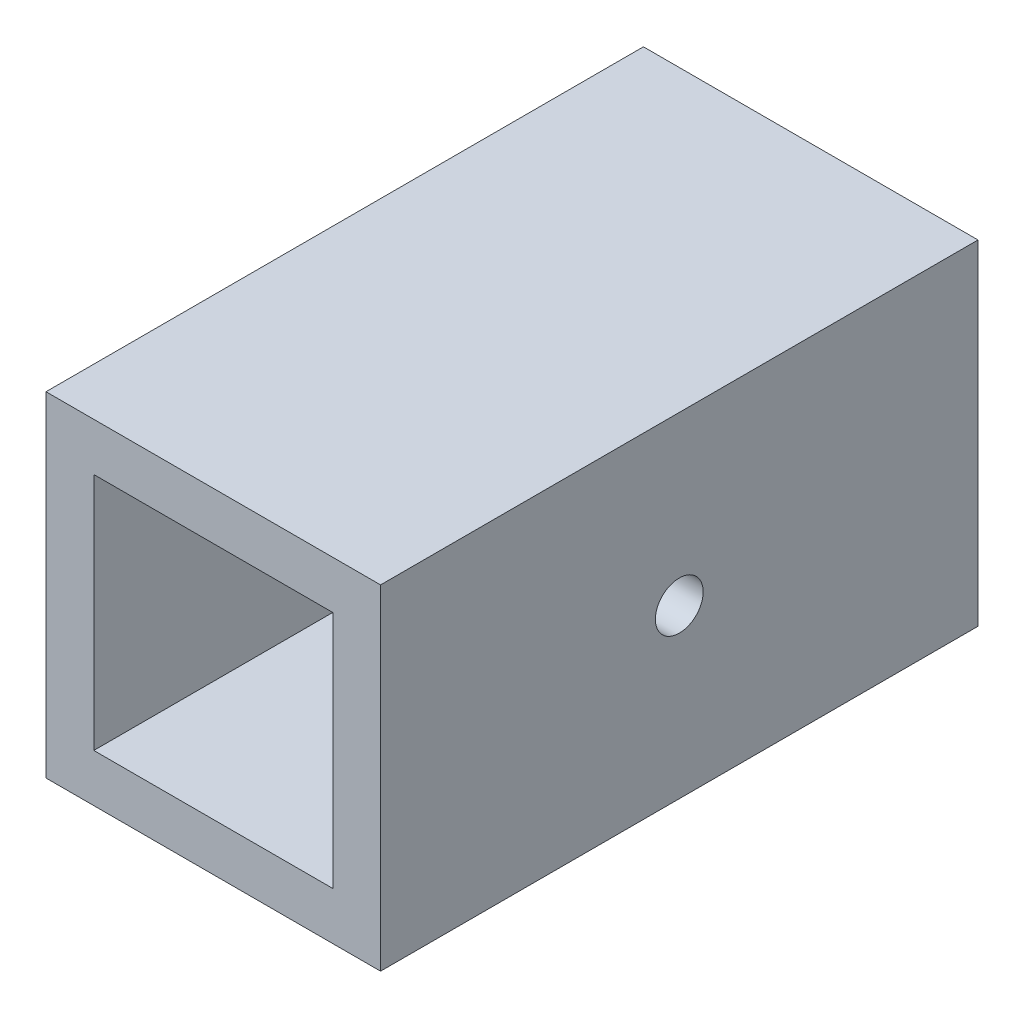
ISO-10303-21;
HEADER;
FILE_DESCRIPTION(('STEP AP214'),'2;1');
FILE_NAME('part.step','',(''),(''),'','','');
FILE_SCHEMA(('AUTOMOTIVE_DESIGN { 1 0 10303 214 1 1 1 1 }'));
ENDSEC;
DATA;
#1=APPLICATION_CONTEXT('core data for automotive mechanical design processes');
#2=APPLICATION_PROTOCOL_DEFINITION('international standard','automotive_design',2000,#1);
#3=PRODUCT_CONTEXT('',#1,'mechanical');
#4=PRODUCT('Part','Part','',(#3));
#5=PRODUCT_RELATED_PRODUCT_CATEGORY('part','',(#4));
#6=PRODUCT_DEFINITION_FORMATION('','',#4);
#7=PRODUCT_DEFINITION_CONTEXT('part definition',#1,'design');
#8=PRODUCT_DEFINITION('design','',#6,#7);
#9=PRODUCT_DEFINITION_SHAPE('','',#8);
#10=(LENGTH_UNIT() NAMED_UNIT(*) SI_UNIT(.MILLI.,.METRE.));
#11=(NAMED_UNIT(*) PLANE_ANGLE_UNIT() SI_UNIT($,.RADIAN.));
#12=(NAMED_UNIT(*) SI_UNIT($,.STERADIAN.) SOLID_ANGLE_UNIT());
#13=UNCERTAINTY_MEASURE_WITH_UNIT(LENGTH_MEASURE(1.E-05),#10,'distance_accuracy_value','');
#14=(GEOMETRIC_REPRESENTATION_CONTEXT(3) GLOBAL_UNCERTAINTY_ASSIGNED_CONTEXT((#13)) GLOBAL_UNIT_ASSIGNED_CONTEXT((#10,
#11,#12)) REPRESENTATION_CONTEXT('',''));
#15=CARTESIAN_POINT('',(0.,0.,0.));
#16=DIRECTION('',(0.,0.,1.));
#17=DIRECTION('',(1.,0.,0.));
#18=AXIS2_PLACEMENT_3D('',#15,#16,#17);
#19=CARTESIAN_POINT('',(0.,0.,0.));
#20=DIRECTION('',(0.,0.,-1.));
#21=DIRECTION('',(-1.,0.,0.));
#22=AXIS2_PLACEMENT_3D('',#19,#20,#21);
#23=PLANE('',#22);
#24=DIRECTION('',(0.,-1.,0.));
#25=VECTOR('',#24,1.);
#26=CARTESIAN_POINT('',(0.,0.,0.));
#27=LINE('',#26,#25);
#28=CARTESIAN_POINT('',(0.,14.,0.));
#29=VERTEX_POINT('',#28);
#30=CARTESIAN_POINT('',(0.,0.,0.));
#31=VERTEX_POINT('',#30);
#32=EDGE_CURVE('E205',#29,#31,#27,.T.);
#33=ORIENTED_EDGE('',*,*,#32,.F.);
#34=DIRECTION('',(-1.,0.,0.));
#35=VECTOR('',#34,1.);
#36=CARTESIAN_POINT('',(0.,14.,0.));
#37=LINE('',#36,#35);
#38=CARTESIAN_POINT('',(14.,14.,0.));
#39=VERTEX_POINT('',#38);
#40=EDGE_CURVE('E212',#39,#29,#37,.T.);
#41=ORIENTED_EDGE('',*,*,#40,.F.);
#42=DIRECTION('',(0.,1.,0.));
#43=VECTOR('',#42,1.);
#44=CARTESIAN_POINT('',(14.,0.,0.));
#45=LINE('',#44,#43);
#46=CARTESIAN_POINT('',(14.,0.,0.));
#47=VERTEX_POINT('',#46);
#48=EDGE_CURVE('E210',#47,#39,#45,.T.);
#49=ORIENTED_EDGE('',*,*,#48,.F.);
#50=DIRECTION('',(1.,0.,0.));
#51=VECTOR('',#50,1.);
#52=CARTESIAN_POINT('',(0.,0.,0.));
#53=LINE('',#52,#51);
#54=EDGE_CURVE('E208',#31,#47,#53,.T.);
#55=ORIENTED_EDGE('',*,*,#54,.F.);
#56=EDGE_LOOP('',(#33,#41,#49,#55));
#57=FACE_BOUND('',#56,.T.);
#58=DIRECTION('',(-1.,0.,0.));
#59=VECTOR('',#58,1.);
#60=CARTESIAN_POINT('',(2.,12.,0.));
#61=LINE('',#60,#59);
#62=CARTESIAN_POINT('',(12.,12.,0.));
#63=VERTEX_POINT('',#62);
#64=CARTESIAN_POINT('',(2.,12.,0.));
#65=VERTEX_POINT('',#64);
#66=EDGE_CURVE('E176',#63,#65,#61,.T.);
#67=ORIENTED_EDGE('',*,*,#66,.T.);
#68=DIRECTION('',(0.,-1.,0.));
#69=VECTOR('',#68,1.);
#70=CARTESIAN_POINT('',(2.,2.,0.));
#71=LINE('',#70,#69);
#72=CARTESIAN_POINT('',(2.,2.,0.));
#73=VERTEX_POINT('',#72);
#74=EDGE_CURVE('E171',#65,#73,#71,.T.);
#75=ORIENTED_EDGE('',*,*,#74,.T.);
#76=DIRECTION('',(1.,0.,0.));
#77=VECTOR('',#76,1.);
#78=CARTESIAN_POINT('',(2.,2.,0.));
#79=LINE('',#78,#77);
#80=CARTESIAN_POINT('',(12.,2.,0.));
#81=VERTEX_POINT('',#80);
#82=EDGE_CURVE('E188',#73,#81,#79,.T.);
#83=ORIENTED_EDGE('',*,*,#82,.T.);
#84=DIRECTION('',(0.,1.,0.));
#85=VECTOR('',#84,1.);
#86=CARTESIAN_POINT('',(12.,2.,0.));
#87=LINE('',#86,#85);
#88=EDGE_CURVE('E191',#81,#63,#87,.T.);
#89=ORIENTED_EDGE('',*,*,#88,.T.);
#90=EDGE_LOOP('',(#67,#75,#83,#89));
#91=FACE_BOUND('',#90,.T.);
#92=ADVANCED_FACE('F33',(#57,#91),#23,.T.);
#93=CARTESIAN_POINT('',(0.,0.,10.));
#94=DIRECTION('',(1.,0.,0.));
#95=DIRECTION('',(0.,0.,-1.));
#96=AXIS2_PLACEMENT_3D('',#93,#94,#95);
#97=PLANE('',#96);
#98=CARTESIAN_POINT('',(0.,7.,12.5));
#99=DIRECTION('',(1.,0.,0.));
#100=DIRECTION('',(0.,0.,-1.));
#101=AXIS2_PLACEMENT_3D('',#98,#99,#100);
#102=CIRCLE('',#101,1.);
#103=CARTESIAN_POINT('',(0.,7.,11.5));
#104=VERTEX_POINT('',#103);
#105=EDGE_CURVE('E150',#104,#104,#102,.T.);
#106=ORIENTED_EDGE('',*,*,#105,.T.);
#107=EDGE_LOOP('',(#106));
#108=FACE_BOUND('',#107,.T.);
#109=ORIENTED_EDGE('',*,*,#32,.T.);
#110=DIRECTION('',(0.,0.,-1.));
#111=VECTOR('',#110,1.);
#112=CARTESIAN_POINT('',(0.,0.,10.));
#113=LINE('',#112,#111);
#114=CARTESIAN_POINT('',(0.,0.,25.));
#115=VERTEX_POINT('',#114);
#116=EDGE_CURVE('E11',#115,#31,#113,.T.);
#117=ORIENTED_EDGE('',*,*,#116,.F.);
#118=DIRECTION('',(0.,-1.,0.));
#119=VECTOR('',#118,1.);
#120=CARTESIAN_POINT('',(0.,14.,25.));
#121=LINE('',#120,#119);
#122=CARTESIAN_POINT('',(0.,14.,25.));
#123=VERTEX_POINT('',#122);
#124=EDGE_CURVE('E136',#123,#115,#121,.T.);
#125=ORIENTED_EDGE('',*,*,#124,.F.);
#126=DIRECTION('',(0.,0.,-1.));
#127=VECTOR('',#126,1.);
#128=CARTESIAN_POINT('',(0.,14.,10.));
#129=LINE('',#128,#127);
#130=EDGE_CURVE('E214',#123,#29,#129,.T.);
#131=ORIENTED_EDGE('',*,*,#130,.T.);
#132=EDGE_LOOP('',(#109,#117,#125,#131));
#133=FACE_BOUND('',#132,.T.);
#134=ADVANCED_FACE('F35',(#108,#133),#97,.F.);
#135=CARTESIAN_POINT('',(0.,0.,10.));
#136=DIRECTION('',(0.,1.,0.));
#137=DIRECTION('',(0.,0.,1.));
#138=AXIS2_PLACEMENT_3D('',#135,#136,#137);
#139=PLANE('',#138);
#140=ORIENTED_EDGE('',*,*,#54,.T.);
#141=DIRECTION('',(0.,0.,-1.));
#142=VECTOR('',#141,1.);
#143=CARTESIAN_POINT('',(14.,0.,10.));
#144=LINE('',#143,#142);
#145=CARTESIAN_POINT('',(14.,0.,25.));
#146=VERTEX_POINT('',#145);
#147=EDGE_CURVE('E41',#146,#47,#144,.T.);
#148=ORIENTED_EDGE('',*,*,#147,.F.);
#149=DIRECTION('',(1.,0.,0.));
#150=VECTOR('',#149,1.);
#151=CARTESIAN_POINT('',(0.,0.,25.));
#152=LINE('',#151,#150);
#153=EDGE_CURVE('E162',#115,#146,#152,.T.);
#154=ORIENTED_EDGE('',*,*,#153,.F.);
#155=ORIENTED_EDGE('',*,*,#116,.T.);
#156=EDGE_LOOP('',(#140,#148,#154,#155));
#157=FACE_BOUND('',#156,.T.);
#158=ADVANCED_FACE('F236',(#157),#139,.F.);
#159=CARTESIAN_POINT('',(14.,0.,10.));
#160=DIRECTION('',(-1.,0.,0.));
#161=DIRECTION('',(0.,0.,1.));
#162=AXIS2_PLACEMENT_3D('',#159,#160,#161);
#163=PLANE('',#162);
#164=CARTESIAN_POINT('',(14.,7.,12.5));
#165=DIRECTION('',(1.,0.,0.));
#166=DIRECTION('',(0.,0.,-1.));
#167=AXIS2_PLACEMENT_3D('',#164,#165,#166);
#168=CIRCLE('',#167,1.);
#169=CARTESIAN_POINT('',(14.,7.,11.5));
#170=VERTEX_POINT('',#169);
#171=EDGE_CURVE('E389',#170,#170,#168,.T.);
#172=ORIENTED_EDGE('',*,*,#171,.F.);
#173=EDGE_LOOP('',(#172));
#174=FACE_BOUND('',#173,.T.);
#175=ORIENTED_EDGE('',*,*,#48,.T.);
#176=DIRECTION('',(0.,0.,-1.));
#177=VECTOR('',#176,1.);
#178=CARTESIAN_POINT('',(14.,14.,10.));
#179=LINE('',#178,#177);
#180=CARTESIAN_POINT('',(14.,14.,25.));
#181=VERTEX_POINT('',#180);
#182=EDGE_CURVE('E217',#181,#39,#179,.T.);
#183=ORIENTED_EDGE('',*,*,#182,.F.);
#184=DIRECTION('',(0.,1.,0.));
#185=VECTOR('',#184,1.);
#186=CARTESIAN_POINT('',(14.,14.,25.));
#187=LINE('',#186,#185);
#188=EDGE_CURVE('E165',#146,#181,#187,.T.);
#189=ORIENTED_EDGE('',*,*,#188,.F.);
#190=ORIENTED_EDGE('',*,*,#147,.T.);
#191=EDGE_LOOP('',(#175,#183,#189,#190));
#192=FACE_BOUND('',#191,.T.);
#193=ADVANCED_FACE('F223',(#174,#192),#163,.F.);
#194=CARTESIAN_POINT('',(0.,14.,10.));
#195=DIRECTION('',(0.,-1.,0.));
#196=DIRECTION('',(0.,0.,-1.));
#197=AXIS2_PLACEMENT_3D('',#194,#195,#196);
#198=PLANE('',#197);
#199=ORIENTED_EDGE('',*,*,#40,.T.);
#200=ORIENTED_EDGE('',*,*,#130,.F.);
#201=DIRECTION('',(-1.,0.,0.));
#202=VECTOR('',#201,1.);
#203=CARTESIAN_POINT('',(0.,14.,25.));
#204=LINE('',#203,#202);
#205=EDGE_CURVE('E168',#181,#123,#204,.T.);
#206=ORIENTED_EDGE('',*,*,#205,.F.);
#207=ORIENTED_EDGE('',*,*,#182,.T.);
#208=EDGE_LOOP('',(#199,#200,#206,#207));
#209=FACE_BOUND('',#208,.T.);
#210=ADVANCED_FACE('F231',(#209),#198,.F.);
#211=CARTESIAN_POINT('',(2.,2.,10.));
#212=DIRECTION('',(1.,0.,0.));
#213=DIRECTION('',(0.,0.,-1.));
#214=AXIS2_PLACEMENT_3D('',#211,#212,#213);
#215=PLANE('',#214);
#216=ORIENTED_EDGE('',*,*,#74,.F.);
#217=DIRECTION('',(0.,0.,-1.));
#218=VECTOR('',#217,1.);
#219=CARTESIAN_POINT('',(2.,12.,10.));
#220=LINE('',#219,#218);
#221=CARTESIAN_POINT('',(2.,12.,10.));
#222=VERTEX_POINT('',#221);
#223=EDGE_CURVE('E185',#222,#65,#220,.T.);
#224=ORIENTED_EDGE('',*,*,#223,.F.);
#225=DIRECTION('',(0.,-1.,0.));
#226=VECTOR('',#225,1.);
#227=CARTESIAN_POINT('',(2.,2.,10.));
#228=LINE('',#227,#226);
#229=CARTESIAN_POINT('',(2.,2.,10.));
#230=VERTEX_POINT('',#229);
#231=EDGE_CURVE('E172',#222,#230,#228,.T.);
#232=ORIENTED_EDGE('',*,*,#231,.T.);
#233=DIRECTION('',(0.,0.,-1.));
#234=VECTOR('',#233,1.);
#235=CARTESIAN_POINT('',(2.,2.,10.));
#236=LINE('',#235,#234);
#237=EDGE_CURVE('E202',#230,#73,#236,.T.);
#238=ORIENTED_EDGE('',*,*,#237,.T.);
#239=EDGE_LOOP('',(#216,#224,#232,#238));
#240=FACE_BOUND('',#239,.T.);
#241=ADVANCED_FACE('F251',(#240),#215,.T.);
#242=CARTESIAN_POINT('',(2.,2.,10.));
#243=DIRECTION('',(0.,1.,0.));
#244=DIRECTION('',(0.,0.,1.));
#245=AXIS2_PLACEMENT_3D('',#242,#243,#244);
#246=PLANE('',#245);
#247=ORIENTED_EDGE('',*,*,#82,.F.);
#248=ORIENTED_EDGE('',*,*,#237,.F.);
#249=DIRECTION('',(1.,0.,0.));
#250=VECTOR('',#249,1.);
#251=CARTESIAN_POINT('',(2.,2.,10.));
#252=LINE('',#251,#250);
#253=CARTESIAN_POINT('',(12.,2.,10.));
#254=VERTEX_POINT('',#253);
#255=EDGE_CURVE('E175',#230,#254,#252,.T.);
#256=ORIENTED_EDGE('',*,*,#255,.T.);
#257=DIRECTION('',(0.,0.,-1.));
#258=VECTOR('',#257,1.);
#259=CARTESIAN_POINT('',(12.,2.,10.));
#260=LINE('',#259,#258);
#261=EDGE_CURVE('E200',#254,#81,#260,.T.);
#262=ORIENTED_EDGE('',*,*,#261,.T.);
#263=EDGE_LOOP('',(#247,#248,#256,#262));
#264=FACE_BOUND('',#263,.T.);
#265=ADVANCED_FACE('F257',(#264),#246,.T.);
#266=CARTESIAN_POINT('',(12.,2.,10.));
#267=DIRECTION('',(-1.,0.,0.));
#268=DIRECTION('',(0.,0.,1.));
#269=AXIS2_PLACEMENT_3D('',#266,#267,#268);
#270=PLANE('',#269);
#271=ORIENTED_EDGE('',*,*,#88,.F.);
#272=ORIENTED_EDGE('',*,*,#261,.F.);
#273=DIRECTION('',(0.,1.,0.));
#274=VECTOR('',#273,1.);
#275=CARTESIAN_POINT('',(12.,2.,10.));
#276=LINE('',#275,#274);
#277=CARTESIAN_POINT('',(12.,12.,10.));
#278=VERTEX_POINT('',#277);
#279=EDGE_CURVE('E179',#254,#278,#276,.T.);
#280=ORIENTED_EDGE('',*,*,#279,.T.);
#281=DIRECTION('',(0.,0.,-1.));
#282=VECTOR('',#281,1.);
#283=CARTESIAN_POINT('',(12.,12.,10.));
#284=LINE('',#283,#282);
#285=EDGE_CURVE('E198',#278,#63,#284,.T.);
#286=ORIENTED_EDGE('',*,*,#285,.T.);
#287=EDGE_LOOP('',(#271,#272,#280,#286));
#288=FACE_BOUND('',#287,.T.);
#289=ADVANCED_FACE('F262',(#288),#270,.T.);
#290=CARTESIAN_POINT('',(2.,12.,10.));
#291=DIRECTION('',(0.,-1.,0.));
#292=DIRECTION('',(0.,0.,-1.));
#293=AXIS2_PLACEMENT_3D('',#290,#291,#292);
#294=PLANE('',#293);
#295=ORIENTED_EDGE('',*,*,#66,.F.);
#296=ORIENTED_EDGE('',*,*,#285,.F.);
#297=DIRECTION('',(-1.,0.,0.));
#298=VECTOR('',#297,1.);
#299=CARTESIAN_POINT('',(2.,12.,10.));
#300=LINE('',#299,#298);
#301=EDGE_CURVE('E182',#278,#222,#300,.T.);
#302=ORIENTED_EDGE('',*,*,#301,.T.);
#303=ORIENTED_EDGE('',*,*,#223,.T.);
#304=EDGE_LOOP('',(#295,#296,#302,#303));
#305=FACE_BOUND('',#304,.T.);
#306=ADVANCED_FACE('F268',(#305),#294,.T.);
#307=CARTESIAN_POINT('',(0.,0.,10.));
#308=DIRECTION('',(0.,0.,1.));
#309=DIRECTION('',(1.,0.,0.));
#310=AXIS2_PLACEMENT_3D('',#307,#308,#309);
#311=PLANE('',#310);
#312=ORIENTED_EDGE('',*,*,#231,.F.);
#313=ORIENTED_EDGE('',*,*,#301,.F.);
#314=ORIENTED_EDGE('',*,*,#279,.F.);
#315=ORIENTED_EDGE('',*,*,#255,.F.);
#316=EDGE_LOOP('',(#312,#313,#314,#315));
#317=FACE_BOUND('',#316,.T.);
#318=ADVANCED_FACE('F274',(#317),#311,.F.);
#319=CARTESIAN_POINT('',(0.,0.,25.));
#320=DIRECTION('',(0.,0.,1.));
#321=DIRECTION('',(1.,0.,0.));
#322=AXIS2_PLACEMENT_3D('',#319,#320,#321);
#323=PLANE('',#322);
#324=ORIENTED_EDGE('',*,*,#124,.T.);
#325=ORIENTED_EDGE('',*,*,#153,.T.);
#326=ORIENTED_EDGE('',*,*,#188,.T.);
#327=ORIENTED_EDGE('',*,*,#205,.T.);
#328=EDGE_LOOP('',(#324,#325,#326,#327));
#329=FACE_BOUND('',#328,.T.);
#330=DIRECTION('',(1.,0.,0.));
#331=VECTOR('',#330,1.);
#332=CARTESIAN_POINT('',(2.,2.,25.));
#333=LINE('',#332,#331);
#334=CARTESIAN_POINT('',(2.,2.,25.));
#335=VERTEX_POINT('',#334);
#336=CARTESIAN_POINT('',(12.,2.,25.));
#337=VERTEX_POINT('',#336);
#338=EDGE_CURVE('E130',#335,#337,#333,.T.);
#339=ORIENTED_EDGE('',*,*,#338,.F.);
#340=DIRECTION('',(0.,-1.,0.));
#341=VECTOR('',#340,1.);
#342=CARTESIAN_POINT('',(2.,12.,25.));
#343=LINE('',#342,#341);
#344=CARTESIAN_POINT('',(2.,12.,25.));
#345=VERTEX_POINT('',#344);
#346=EDGE_CURVE('E121',#345,#335,#343,.T.);
#347=ORIENTED_EDGE('',*,*,#346,.F.);
#348=DIRECTION('',(-1.,0.,0.));
#349=VECTOR('',#348,1.);
#350=CARTESIAN_POINT('',(2.,12.,25.));
#351=LINE('',#350,#349);
#352=CARTESIAN_POINT('',(12.,12.,25.));
#353=VERTEX_POINT('',#352);
#354=EDGE_CURVE('E144',#353,#345,#351,.T.);
#355=ORIENTED_EDGE('',*,*,#354,.F.);
#356=DIRECTION('',(0.,1.,0.));
#357=VECTOR('',#356,1.);
#358=CARTESIAN_POINT('',(12.,12.,25.));
#359=LINE('',#358,#357);
#360=EDGE_CURVE('E142',#337,#353,#359,.T.);
#361=ORIENTED_EDGE('',*,*,#360,.F.);
#362=EDGE_LOOP('',(#339,#347,#355,#361));
#363=FACE_BOUND('',#362,.T.);
#364=ADVANCED_FACE('F140',(#329,#363),#323,.T.);
#365=CARTESIAN_POINT('',(2.,12.,25.));
#366=DIRECTION('',(1.,0.,0.));
#367=DIRECTION('',(0.,1.,0.));
#368=AXIS2_PLACEMENT_3D('',#365,#366,#367);
#369=PLANE('',#368);
#370=DIRECTION('',(0.,-1.,0.));
#371=VECTOR('',#370,1.);
#372=CARTESIAN_POINT('',(2.,12.,15.));
#373=LINE('',#372,#371);
#374=CARTESIAN_POINT('',(2.,12.,15.));
#375=VERTEX_POINT('',#374);
#376=CARTESIAN_POINT('',(2.,2.,15.));
#377=VERTEX_POINT('',#376);
#378=EDGE_CURVE('E48',#375,#377,#373,.T.);
#379=ORIENTED_EDGE('',*,*,#378,.F.);
#380=DIRECTION('',(0.,0.,-1.));
#381=VECTOR('',#380,1.);
#382=CARTESIAN_POINT('',(2.,12.,25.));
#383=LINE('',#382,#381);
#384=EDGE_CURVE('E126',#345,#375,#383,.T.);
#385=ORIENTED_EDGE('',*,*,#384,.F.);
#386=ORIENTED_EDGE('',*,*,#346,.T.);
#387=DIRECTION('',(0.,0.,-1.));
#388=VECTOR('',#387,1.);
#389=CARTESIAN_POINT('',(2.,2.,25.));
#390=LINE('',#389,#388);
#391=EDGE_CURVE('E124',#335,#377,#390,.T.);
#392=ORIENTED_EDGE('',*,*,#391,.T.);
#393=EDGE_LOOP('',(#379,#385,#386,#392));
#394=FACE_BOUND('',#393,.T.);
#395=ADVANCED_FACE('F123',(#394),#369,.T.);
#396=CARTESIAN_POINT('',(2.,2.,25.));
#397=DIRECTION('',(0.,1.,0.));
#398=DIRECTION('',(0.,0.,1.));
#399=AXIS2_PLACEMENT_3D('',#396,#397,#398);
#400=PLANE('',#399);
#401=DIRECTION('',(1.,0.,0.));
#402=VECTOR('',#401,1.);
#403=CARTESIAN_POINT('',(2.,2.,15.));
#404=LINE('',#403,#402);
#405=CARTESIAN_POINT('',(12.,2.,15.));
#406=VERTEX_POINT('',#405);
#407=EDGE_CURVE('E52',#377,#406,#404,.T.);
#408=ORIENTED_EDGE('',*,*,#407,.F.);
#409=ORIENTED_EDGE('',*,*,#391,.F.);
#410=ORIENTED_EDGE('',*,*,#338,.T.);
#411=DIRECTION('',(0.,0.,-1.));
#412=VECTOR('',#411,1.);
#413=CARTESIAN_POINT('',(12.,2.,25.));
#414=LINE('',#413,#412);
#415=EDGE_CURVE('E137',#337,#406,#414,.T.);
#416=ORIENTED_EDGE('',*,*,#415,.T.);
#417=EDGE_LOOP('',(#408,#409,#410,#416));
#418=FACE_BOUND('',#417,.T.);
#419=ADVANCED_FACE('F134',(#418),#400,.T.);
#420=CARTESIAN_POINT('',(12.,12.,25.));
#421=DIRECTION('',(-1.,0.,0.));
#422=DIRECTION('',(0.,-1.,0.));
#423=AXIS2_PLACEMENT_3D('',#420,#421,#422);
#424=PLANE('',#423);
#425=DIRECTION('',(0.,1.,0.));
#426=VECTOR('',#425,1.);
#427=CARTESIAN_POINT('',(12.,12.,15.));
#428=LINE('',#427,#426);
#429=CARTESIAN_POINT('',(12.,12.,15.));
#430=VERTEX_POINT('',#429);
#431=EDGE_CURVE('E152',#406,#430,#428,.T.);
#432=ORIENTED_EDGE('',*,*,#431,.F.);
#433=ORIENTED_EDGE('',*,*,#415,.F.);
#434=ORIENTED_EDGE('',*,*,#360,.T.);
#435=DIRECTION('',(0.,0.,-1.));
#436=VECTOR('',#435,1.);
#437=CARTESIAN_POINT('',(12.,12.,25.));
#438=LINE('',#437,#436);
#439=EDGE_CURVE('E156',#353,#430,#438,.T.);
#440=ORIENTED_EDGE('',*,*,#439,.T.);
#441=EDGE_LOOP('',(#432,#433,#434,#440));
#442=FACE_BOUND('',#441,.T.);
#443=ADVANCED_FACE('F336',(#442),#424,.T.);
#444=CARTESIAN_POINT('',(2.,12.,25.));
#445=DIRECTION('',(0.,-1.,0.));
#446=DIRECTION('',(0.,0.,-1.));
#447=AXIS2_PLACEMENT_3D('',#444,#445,#446);
#448=PLANE('',#447);
#449=DIRECTION('',(-1.,0.,0.));
#450=VECTOR('',#449,1.);
#451=CARTESIAN_POINT('',(2.,12.,15.));
#452=LINE('',#451,#450);
#453=EDGE_CURVE('E131',#430,#375,#452,.T.);
#454=ORIENTED_EDGE('',*,*,#453,.F.);
#455=ORIENTED_EDGE('',*,*,#439,.F.);
#456=ORIENTED_EDGE('',*,*,#354,.T.);
#457=ORIENTED_EDGE('',*,*,#384,.T.);
#458=EDGE_LOOP('',(#454,#455,#456,#457));
#459=FACE_BOUND('',#458,.T.);
#460=ADVANCED_FACE('F345',(#459),#448,.T.);
#461=CARTESIAN_POINT('',(0.,0.,15.));
#462=DIRECTION('',(0.,0.,1.));
#463=DIRECTION('',(1.,0.,0.));
#464=AXIS2_PLACEMENT_3D('',#461,#462,#463);
#465=PLANE('',#464);
#466=ORIENTED_EDGE('',*,*,#378,.T.);
#467=ORIENTED_EDGE('',*,*,#407,.T.);
#468=ORIENTED_EDGE('',*,*,#431,.T.);
#469=ORIENTED_EDGE('',*,*,#453,.T.);
#470=EDGE_LOOP('',(#466,#467,#468,#469));
#471=FACE_BOUND('',#470,.T.);
#472=ADVANCED_FACE('F284',(#471),#465,.T.);
#473=CARTESIAN_POINT('',(-2.,7.,12.5));
#474=DIRECTION('',(1.,0.,0.));
#475=DIRECTION('',(0.,0.,-1.));
#476=AXIS2_PLACEMENT_3D('',#473,#474,#475);
#477=CYLINDRICAL_SURFACE('',#476,1.);
#478=ORIENTED_EDGE('',*,*,#171,.T.);
#479=EDGE_LOOP('',(#478));
#480=FACE_BOUND('',#479,.T.);
#481=ORIENTED_EDGE('',*,*,#105,.F.);
#482=EDGE_LOOP('',(#481));
#483=FACE_BOUND('',#482,.T.);
#484=ADVANCED_FACE('F364',(#480,#483),#477,.F.);
#485=CLOSED_SHELL('',(#92,#134,#158,#193,#210,#241,#265,#289,#306,#318,#364,#395,#419,#443,#460,
#472,#484));
#486=MANIFOLD_SOLID_BREP('B2',#485);
#487=ADVANCED_BREP_SHAPE_REPRESENTATION('',(#18,#486),#14);
#488=SHAPE_DEFINITION_REPRESENTATION(#9,#487);
ENDSEC;
END-ISO-10303-21;
